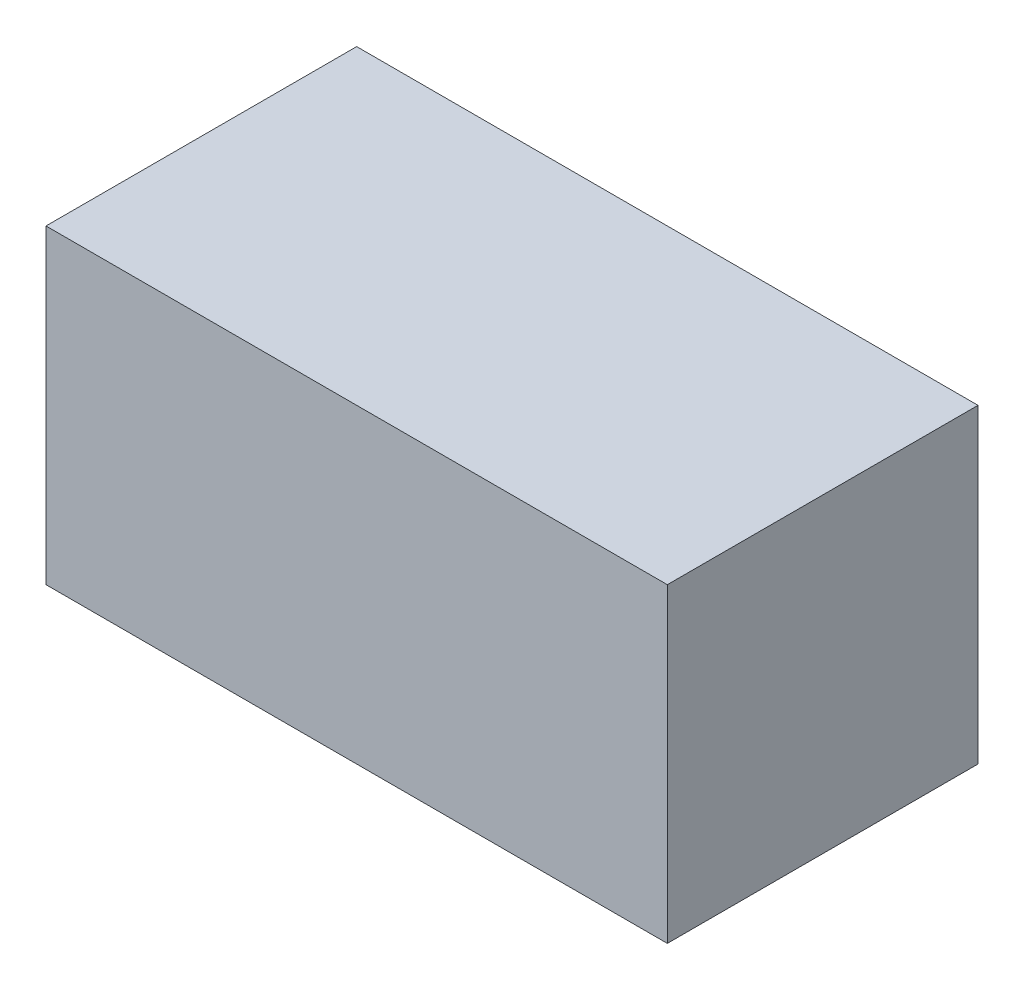
ISO-10303-21;
HEADER;
FILE_DESCRIPTION(('STEP AP214'),'2;1');
FILE_NAME('part.step','',(''),(''),'','','');
FILE_SCHEMA(('AUTOMOTIVE_DESIGN { 1 0 10303 214 1 1 1 1 }'));
ENDSEC;
DATA;
#1=APPLICATION_CONTEXT('core data for automotive mechanical design processes');
#2=APPLICATION_PROTOCOL_DEFINITION('international standard','automotive_design',2000,#1);
#3=PRODUCT_CONTEXT('',#1,'mechanical');
#4=PRODUCT('Part','Part','',(#3));
#5=PRODUCT_RELATED_PRODUCT_CATEGORY('part','',(#4));
#6=PRODUCT_DEFINITION_FORMATION('','',#4);
#7=PRODUCT_DEFINITION_CONTEXT('part definition',#1,'design');
#8=PRODUCT_DEFINITION('design','',#6,#7);
#9=PRODUCT_DEFINITION_SHAPE('','',#8);
#10=(LENGTH_UNIT() NAMED_UNIT(*) SI_UNIT(.MILLI.,.METRE.));
#11=(NAMED_UNIT(*) PLANE_ANGLE_UNIT() SI_UNIT($,.RADIAN.));
#12=(NAMED_UNIT(*) SI_UNIT($,.STERADIAN.) SOLID_ANGLE_UNIT());
#13=UNCERTAINTY_MEASURE_WITH_UNIT(LENGTH_MEASURE(1.E-05),#10,'distance_accuracy_value','');
#14=(GEOMETRIC_REPRESENTATION_CONTEXT(3) GLOBAL_UNCERTAINTY_ASSIGNED_CONTEXT((#13)) GLOBAL_UNIT_ASSIGNED_CONTEXT((#10,
#11,#12)) REPRESENTATION_CONTEXT('',''));
#15=CARTESIAN_POINT('',(0.,0.,0.));
#16=DIRECTION('',(0.,0.,1.));
#17=DIRECTION('',(1.,0.,0.));
#18=AXIS2_PLACEMENT_3D('',#15,#16,#17);
#19=CARTESIAN_POINT('',(20.,-10.,20.));
#20=DIRECTION('',(-1.,0.,0.));
#21=DIRECTION('',(0.,0.,1.));
#22=AXIS2_PLACEMENT_3D('',#19,#20,#21);
#23=PLANE('',#22);
#24=DIRECTION('',(0.,1.,0.));
#25=VECTOR('',#24,1.);
#26=CARTESIAN_POINT('',(20.,-10.,0.));
#27=LINE('',#26,#25);
#28=CARTESIAN_POINT('',(20.,-10.,0.));
#29=VERTEX_POINT('',#28);
#30=CARTESIAN_POINT('',(20.,10.,0.));
#31=VERTEX_POINT('',#30);
#32=EDGE_CURVE('E98',#29,#31,#27,.T.);
#33=ORIENTED_EDGE('',*,*,#32,.T.);
#34=DIRECTION('',(0.,0.,-1.));
#35=VECTOR('',#34,1.);
#36=CARTESIAN_POINT('',(20.,10.,20.));
#37=LINE('',#36,#35);
#38=CARTESIAN_POINT('',(20.,10.,20.));
#39=VERTEX_POINT('',#38);
#40=EDGE_CURVE('E11',#39,#31,#37,.T.);
#41=ORIENTED_EDGE('',*,*,#40,.F.);
#42=DIRECTION('',(0.,1.,0.));
#43=VECTOR('',#42,1.);
#44=CARTESIAN_POINT('',(20.,-10.,20.));
#45=LINE('',#44,#43);
#46=CARTESIAN_POINT('',(20.,-10.,20.));
#47=VERTEX_POINT('',#46);
#48=EDGE_CURVE('E86',#47,#39,#45,.T.);
#49=ORIENTED_EDGE('',*,*,#48,.F.);
#50=DIRECTION('',(0.,0.,-1.));
#51=VECTOR('',#50,1.);
#52=CARTESIAN_POINT('',(20.,-10.,20.));
#53=LINE('',#52,#51);
#54=EDGE_CURVE('E94',#47,#29,#53,.T.);
#55=ORIENTED_EDGE('',*,*,#54,.T.);
#56=EDGE_LOOP('',(#33,#41,#49,#55));
#57=FACE_BOUND('',#56,.T.);
#58=ADVANCED_FACE('F35',(#57),#23,.F.);
#59=CARTESIAN_POINT('',(-20.,10.,20.));
#60=DIRECTION('',(0.,-1.,0.));
#61=DIRECTION('',(0.,0.,-1.));
#62=AXIS2_PLACEMENT_3D('',#59,#60,#61);
#63=PLANE('',#62);
#64=DIRECTION('',(-1.,0.,0.));
#65=VECTOR('',#64,1.);
#66=CARTESIAN_POINT('',(-20.,10.,0.));
#67=LINE('',#66,#65);
#68=CARTESIAN_POINT('',(-20.,10.,0.));
#69=VERTEX_POINT('',#68);
#70=EDGE_CURVE('E90',#31,#69,#67,.T.);
#71=ORIENTED_EDGE('',*,*,#70,.T.);
#72=DIRECTION('',(0.,0.,-1.));
#73=VECTOR('',#72,1.);
#74=CARTESIAN_POINT('',(-20.,10.,20.));
#75=LINE('',#74,#73);
#76=CARTESIAN_POINT('',(-20.,10.,20.));
#77=VERTEX_POINT('',#76);
#78=EDGE_CURVE('E43',#77,#69,#75,.T.);
#79=ORIENTED_EDGE('',*,*,#78,.F.);
#80=DIRECTION('',(-1.,0.,0.));
#81=VECTOR('',#80,1.);
#82=CARTESIAN_POINT('',(-20.,10.,20.));
#83=LINE('',#82,#81);
#84=EDGE_CURVE('E81',#39,#77,#83,.T.);
#85=ORIENTED_EDGE('',*,*,#84,.F.);
#86=ORIENTED_EDGE('',*,*,#40,.T.);
#87=EDGE_LOOP('',(#71,#79,#85,#86));
#88=FACE_BOUND('',#87,.T.);
#89=ADVANCED_FACE('F89',(#88),#63,.F.);
#90=CARTESIAN_POINT('',(-20.,-10.,20.));
#91=DIRECTION('',(1.,0.,0.));
#92=DIRECTION('',(0.,0.,-1.));
#93=AXIS2_PLACEMENT_3D('',#90,#91,#92);
#94=PLANE('',#93);
#95=DIRECTION('',(0.,-1.,0.));
#96=VECTOR('',#95,1.);
#97=CARTESIAN_POINT('',(-20.,-10.,0.));
#98=LINE('',#97,#96);
#99=CARTESIAN_POINT('',(-20.,-10.,0.));
#100=VERTEX_POINT('',#99);
#101=EDGE_CURVE('E68',#69,#100,#98,.T.);
#102=ORIENTED_EDGE('',*,*,#101,.T.);
#103=DIRECTION('',(0.,0.,-1.));
#104=VECTOR('',#103,1.);
#105=CARTESIAN_POINT('',(-20.,-10.,20.));
#106=LINE('',#105,#104);
#107=CARTESIAN_POINT('',(-20.,-10.,20.));
#108=VERTEX_POINT('',#107);
#109=EDGE_CURVE('E91',#108,#100,#106,.T.);
#110=ORIENTED_EDGE('',*,*,#109,.F.);
#111=DIRECTION('',(0.,-1.,0.));
#112=VECTOR('',#111,1.);
#113=CARTESIAN_POINT('',(-20.,-10.,20.));
#114=LINE('',#113,#112);
#115=EDGE_CURVE('E84',#77,#108,#114,.T.);
#116=ORIENTED_EDGE('',*,*,#115,.F.);
#117=ORIENTED_EDGE('',*,*,#78,.T.);
#118=EDGE_LOOP('',(#102,#110,#116,#117));
#119=FACE_BOUND('',#118,.T.);
#120=ADVANCED_FACE('F92',(#119),#94,.F.);
#121=CARTESIAN_POINT('',(-20.,-10.,20.));
#122=DIRECTION('',(0.,1.,0.));
#123=DIRECTION('',(0.,0.,1.));
#124=AXIS2_PLACEMENT_3D('',#121,#122,#123);
#125=PLANE('',#124);
#126=DIRECTION('',(1.,0.,0.));
#127=VECTOR('',#126,1.);
#128=CARTESIAN_POINT('',(-20.,-10.,0.));
#129=LINE('',#128,#127);
#130=EDGE_CURVE('E74',#100,#29,#129,.T.);
#131=ORIENTED_EDGE('',*,*,#130,.T.);
#132=ORIENTED_EDGE('',*,*,#54,.F.);
#133=DIRECTION('',(1.,0.,0.));
#134=VECTOR('',#133,1.);
#135=CARTESIAN_POINT('',(-20.,-10.,20.));
#136=LINE('',#135,#134);
#137=EDGE_CURVE('E51',#108,#47,#136,.T.);
#138=ORIENTED_EDGE('',*,*,#137,.F.);
#139=ORIENTED_EDGE('',*,*,#109,.T.);
#140=EDGE_LOOP('',(#131,#132,#138,#139));
#141=FACE_BOUND('',#140,.T.);
#142=ADVANCED_FACE('F105',(#141),#125,.F.);
#143=CARTESIAN_POINT('',(0.,0.,20.));
#144=DIRECTION('',(0.,0.,-1.));
#145=DIRECTION('',(-1.,0.,0.));
#146=AXIS2_PLACEMENT_3D('',#143,#144,#145);
#147=PLANE('',#146);
#148=ORIENTED_EDGE('',*,*,#48,.T.);
#149=ORIENTED_EDGE('',*,*,#84,.T.);
#150=ORIENTED_EDGE('',*,*,#115,.T.);
#151=ORIENTED_EDGE('',*,*,#137,.T.);
#152=EDGE_LOOP('',(#148,#149,#150,#151));
#153=FACE_BOUND('',#152,.T.);
#154=ADVANCED_FACE('F82',(#153),#147,.F.);
#155=CARTESIAN_POINT('',(0.,0.,0.));
#156=DIRECTION('',(0.,0.,-1.));
#157=DIRECTION('',(-1.,0.,0.));
#158=AXIS2_PLACEMENT_3D('',#155,#156,#157);
#159=PLANE('',#158);
#160=ORIENTED_EDGE('',*,*,#32,.F.);
#161=ORIENTED_EDGE('',*,*,#130,.F.);
#162=ORIENTED_EDGE('',*,*,#101,.F.);
#163=ORIENTED_EDGE('',*,*,#70,.F.);
#164=EDGE_LOOP('',(#160,#161,#162,#163));
#165=FACE_BOUND('',#164,.T.);
#166=ADVANCED_FACE('F108',(#165),#159,.T.);
#167=CLOSED_SHELL('',(#58,#89,#120,#142,#154,#166));
#168=MANIFOLD_SOLID_BREP('B2',#167);
#169=ADVANCED_BREP_SHAPE_REPRESENTATION('',(#18,#168),#14);
#170=SHAPE_DEFINITION_REPRESENTATION(#9,#169);
ENDSEC;
END-ISO-10303-21;
